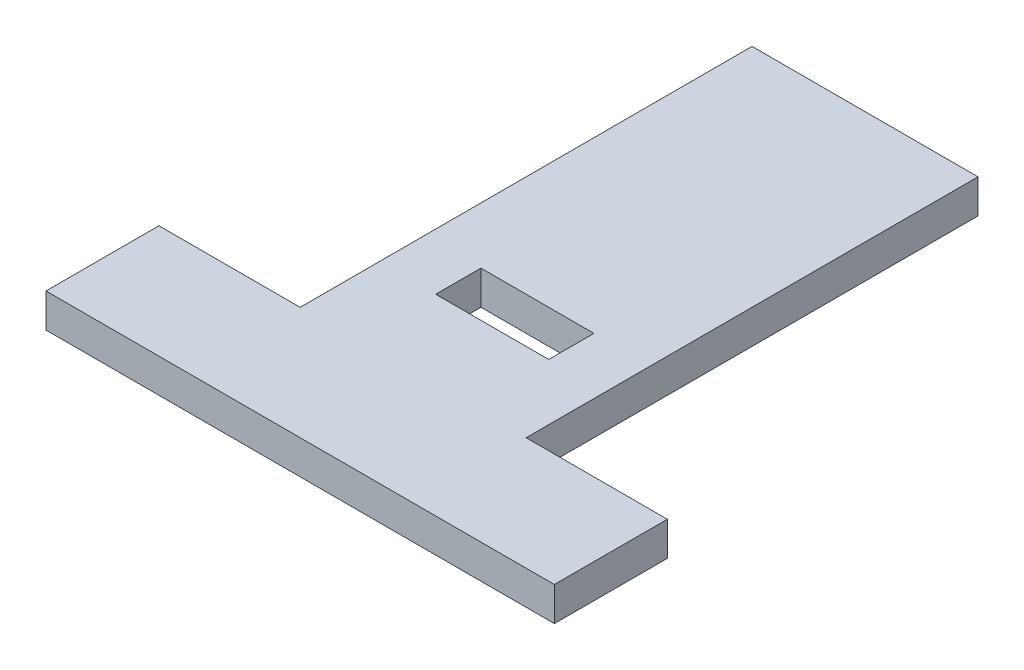
ISO-10303-21;
HEADER;
FILE_DESCRIPTION(('STEP AP214'),'2;1');
FILE_NAME('part.step','',(''),(''),'','','');
FILE_SCHEMA(('AUTOMOTIVE_DESIGN { 1 0 10303 214 1 1 1 1 }'));
ENDSEC;
DATA;
#1=APPLICATION_CONTEXT('core data for automotive mechanical design processes');
#2=APPLICATION_PROTOCOL_DEFINITION('international standard','automotive_design',2000,#1);
#3=PRODUCT_CONTEXT('',#1,'mechanical');
#4=PRODUCT('Part','Part','',(#3));
#5=PRODUCT_RELATED_PRODUCT_CATEGORY('part','',(#4));
#6=PRODUCT_DEFINITION_FORMATION('','',#4);
#7=PRODUCT_DEFINITION_CONTEXT('part definition',#1,'design');
#8=PRODUCT_DEFINITION('design','',#6,#7);
#9=PRODUCT_DEFINITION_SHAPE('','',#8);
#10=(LENGTH_UNIT() NAMED_UNIT(*) SI_UNIT(.MILLI.,.METRE.));
#11=(NAMED_UNIT(*) PLANE_ANGLE_UNIT() SI_UNIT($,.RADIAN.));
#12=(NAMED_UNIT(*) SI_UNIT($,.STERADIAN.) SOLID_ANGLE_UNIT());
#13=UNCERTAINTY_MEASURE_WITH_UNIT(LENGTH_MEASURE(1.E-05),#10,'distance_accuracy_value','');
#14=(GEOMETRIC_REPRESENTATION_CONTEXT(3) GLOBAL_UNCERTAINTY_ASSIGNED_CONTEXT((#13)) GLOBAL_UNIT_ASSIGNED_CONTEXT((#10,
#11,#12)) REPRESENTATION_CONTEXT('',''));
#15=CARTESIAN_POINT('',(0.,0.,0.));
#16=DIRECTION('',(0.,0.,1.));
#17=DIRECTION('',(1.,0.,0.));
#18=AXIS2_PLACEMENT_3D('',#15,#16,#17);
#19=CARTESIAN_POINT('',(22.5,3.,-25.));
#20=DIRECTION('',(-1.,0.,0.));
#21=DIRECTION('',(0.,0.,1.));
#22=AXIS2_PLACEMENT_3D('',#19,#20,#21);
#23=PLANE('',#22);
#24=DIRECTION('',(0.,0.,-1.));
#25=VECTOR('',#24,1.);
#26=CARTESIAN_POINT('',(22.5,0.,-25.));
#27=LINE('',#26,#25);
#28=CARTESIAN_POINT('',(22.5,0.,25.));
#29=VERTEX_POINT('',#28);
#30=CARTESIAN_POINT('',(22.5,0.,15.));
#31=VERTEX_POINT('',#30);
#32=EDGE_CURVE('E159',#29,#31,#27,.T.);
#33=ORIENTED_EDGE('',*,*,#32,.T.);
#34=DIRECTION('',(0.,1.,0.));
#35=VECTOR('',#34,1.);
#36=CARTESIAN_POINT('',(22.5,0.,15.));
#37=LINE('',#36,#35);
#38=CARTESIAN_POINT('',(22.5,3.,15.));
#39=VERTEX_POINT('',#38);
#40=EDGE_CURVE('E209',#31,#39,#37,.T.);
#41=ORIENTED_EDGE('',*,*,#40,.T.);
#42=DIRECTION('',(0.,0.,-1.));
#43=VECTOR('',#42,1.);
#44=CARTESIAN_POINT('',(22.5,3.,-25.));
#45=LINE('',#44,#43);
#46=CARTESIAN_POINT('',(22.5,3.,25.));
#47=VERTEX_POINT('',#46);
#48=EDGE_CURVE('E156',#47,#39,#45,.T.);
#49=ORIENTED_EDGE('',*,*,#48,.F.);
#50=DIRECTION('',(0.,-1.,0.));
#51=VECTOR('',#50,1.);
#52=CARTESIAN_POINT('',(22.5,3.,25.));
#53=LINE('',#52,#51);
#54=EDGE_CURVE('E47',#47,#29,#53,.T.);
#55=ORIENTED_EDGE('',*,*,#54,.T.);
#56=EDGE_LOOP('',(#33,#41,#49,#55));
#57=FACE_BOUND('',#56,.T.);
#58=ADVANCED_FACE('F39',(#57),#23,.F.);
#59=CARTESIAN_POINT('',(-22.5,3.,-25.));
#60=DIRECTION('',(0.,0.,1.));
#61=DIRECTION('',(1.,0.,0.));
#62=AXIS2_PLACEMENT_3D('',#59,#60,#61);
#63=PLANE('',#62);
#64=DIRECTION('',(-1.,0.,0.));
#65=VECTOR('',#64,1.);
#66=CARTESIAN_POINT('',(-22.5,0.,-25.));
#67=LINE('',#66,#65);
#68=CARTESIAN_POINT('',(9.99999999999999,0.,-25.));
#69=VERTEX_POINT('',#68);
#70=CARTESIAN_POINT('',(-10.,0.,-25.));
#71=VERTEX_POINT('',#70);
#72=EDGE_CURVE('E152',#69,#71,#67,.T.);
#73=ORIENTED_EDGE('',*,*,#72,.T.);
#74=DIRECTION('',(0.,1.,0.));
#75=VECTOR('',#74,1.);
#76=CARTESIAN_POINT('',(-10.,0.,-25.));
#77=LINE('',#76,#75);
#78=CARTESIAN_POINT('',(-10.,3.,-25.));
#79=VERTEX_POINT('',#78);
#80=EDGE_CURVE('E179',#71,#79,#77,.T.);
#81=ORIENTED_EDGE('',*,*,#80,.T.);
#82=DIRECTION('',(-1.,0.,0.));
#83=VECTOR('',#82,1.);
#84=CARTESIAN_POINT('',(-22.5,3.,-25.));
#85=LINE('',#84,#83);
#86=CARTESIAN_POINT('',(9.99999999999999,3.,-25.));
#87=VERTEX_POINT('',#86);
#88=EDGE_CURVE('E175',#87,#79,#85,.T.);
#89=ORIENTED_EDGE('',*,*,#88,.F.);
#90=DIRECTION('',(0.,1.,0.));
#91=VECTOR('',#90,1.);
#92=CARTESIAN_POINT('',(9.99999999999999,0.,-25.));
#93=LINE('',#92,#91);
#94=EDGE_CURVE('E201',#69,#87,#93,.T.);
#95=ORIENTED_EDGE('',*,*,#94,.F.);
#96=EDGE_LOOP('',(#73,#81,#89,#95));
#97=FACE_BOUND('',#96,.T.);
#98=ADVANCED_FACE('F267',(#97),#63,.F.);
#99=CARTESIAN_POINT('',(-22.5,3.,-25.));
#100=DIRECTION('',(1.,0.,0.));
#101=DIRECTION('',(0.,0.,-1.));
#102=AXIS2_PLACEMENT_3D('',#99,#100,#101);
#103=PLANE('',#102);
#104=DIRECTION('',(0.,0.,1.));
#105=VECTOR('',#104,1.);
#106=CARTESIAN_POINT('',(-22.5,3.,-25.));
#107=LINE('',#106,#105);
#108=CARTESIAN_POINT('',(-22.5,3.,15.0036554994902));
#109=VERTEX_POINT('',#108);
#110=CARTESIAN_POINT('',(-22.5,3.,25.));
#111=VERTEX_POINT('',#110);
#112=EDGE_CURVE('E144',#109,#111,#107,.T.);
#113=ORIENTED_EDGE('',*,*,#112,.F.);
#114=DIRECTION('',(0.,1.,0.));
#115=VECTOR('',#114,1.);
#116=CARTESIAN_POINT('',(-22.5,0.,15.0036554994902));
#117=LINE('',#116,#115);
#118=CARTESIAN_POINT('',(-22.5,0.,15.0036554994902));
#119=VERTEX_POINT('',#118);
#120=EDGE_CURVE('E131',#119,#109,#117,.T.);
#121=ORIENTED_EDGE('',*,*,#120,.F.);
#122=DIRECTION('',(0.,0.,1.));
#123=VECTOR('',#122,1.);
#124=CARTESIAN_POINT('',(-22.5,0.,-25.));
#125=LINE('',#124,#123);
#126=CARTESIAN_POINT('',(-22.5,0.,25.));
#127=VERTEX_POINT('',#126);
#128=EDGE_CURVE('E143',#119,#127,#125,.T.);
#129=ORIENTED_EDGE('',*,*,#128,.T.);
#130=DIRECTION('',(0.,-1.,0.));
#131=VECTOR('',#130,1.);
#132=CARTESIAN_POINT('',(-22.5,3.,25.));
#133=LINE('',#132,#131);
#134=EDGE_CURVE('E11',#111,#127,#133,.T.);
#135=ORIENTED_EDGE('',*,*,#134,.F.);
#136=EDGE_LOOP('',(#113,#121,#129,#135));
#137=FACE_BOUND('',#136,.T.);
#138=ADVANCED_FACE('F141',(#137),#103,.F.);
#139=CARTESIAN_POINT('',(-22.5,3.,25.));
#140=DIRECTION('',(0.,0.,-1.));
#141=DIRECTION('',(-1.,0.,0.));
#142=AXIS2_PLACEMENT_3D('',#139,#140,#141);
#143=PLANE('',#142);
#144=DIRECTION('',(1.,0.,0.));
#145=VECTOR('',#144,1.);
#146=CARTESIAN_POINT('',(-22.5,0.,25.));
#147=LINE('',#146,#145);
#148=EDGE_CURVE('E150',#127,#29,#147,.T.);
#149=ORIENTED_EDGE('',*,*,#148,.T.);
#150=ORIENTED_EDGE('',*,*,#54,.F.);
#151=DIRECTION('',(1.,0.,0.));
#152=VECTOR('',#151,1.);
#153=CARTESIAN_POINT('',(-22.5,3.,25.));
#154=LINE('',#153,#152);
#155=EDGE_CURVE('E164',#111,#47,#154,.T.);
#156=ORIENTED_EDGE('',*,*,#155,.F.);
#157=ORIENTED_EDGE('',*,*,#134,.T.);
#158=EDGE_LOOP('',(#149,#150,#156,#157));
#159=FACE_BOUND('',#158,.T.);
#160=ADVANCED_FACE('F292',(#159),#143,.F.);
#161=CARTESIAN_POINT('',(0.,3.,0.));
#162=DIRECTION('',(0.,1.,0.));
#163=DIRECTION('',(0.,0.,1.));
#164=AXIS2_PLACEMENT_3D('',#161,#162,#163);
#165=PLANE('',#164);
#166=DIRECTION('',(0.,0.,-1.));
#167=VECTOR('',#166,1.);
#168=CARTESIAN_POINT('',(-10.,3.,-25.));
#169=LINE('',#168,#167);
#170=CARTESIAN_POINT('',(-10.,3.,15.0036554994902));
#171=VERTEX_POINT('',#170);
#172=EDGE_CURVE('E137',#171,#79,#169,.T.);
#173=ORIENTED_EDGE('',*,*,#172,.F.);
#174=DIRECTION('',(1.,0.,0.));
#175=VECTOR('',#174,1.);
#176=CARTESIAN_POINT('',(-22.5,3.,15.0036554994902));
#177=LINE('',#176,#175);
#178=EDGE_CURVE('E212',#109,#171,#177,.T.);
#179=ORIENTED_EDGE('',*,*,#178,.F.);
#180=ORIENTED_EDGE('',*,*,#112,.T.);
#181=ORIENTED_EDGE('',*,*,#155,.T.);
#182=ORIENTED_EDGE('',*,*,#48,.T.);
#183=DIRECTION('',(1.,0.,0.));
#184=VECTOR('',#183,1.);
#185=CARTESIAN_POINT('',(22.5,3.,15.));
#186=LINE('',#185,#184);
#187=CARTESIAN_POINT('',(10.,3.,15.));
#188=VERTEX_POINT('',#187);
#189=EDGE_CURVE('E197',#188,#39,#186,.T.);
#190=ORIENTED_EDGE('',*,*,#189,.F.);
#191=DIRECTION('',(0.,0.,1.));
#192=VECTOR('',#191,1.);
#193=CARTESIAN_POINT('',(9.99999999999999,3.,-25.));
#194=LINE('',#193,#192);
#195=EDGE_CURVE('E202',#87,#188,#194,.T.);
#196=ORIENTED_EDGE('',*,*,#195,.F.);
#197=ORIENTED_EDGE('',*,*,#88,.T.);
#198=EDGE_LOOP('',(#173,#179,#180,#181,#182,#190,#196,#197));
#199=FACE_BOUND('',#198,.T.);
#200=DIRECTION('',(0.,0.,1.));
#201=VECTOR('',#200,1.);
#202=CARTESIAN_POINT('',(-5.,3.,4.));
#203=LINE('',#202,#201);
#204=CARTESIAN_POINT('',(-5.,3.,4.));
#205=VERTEX_POINT('',#204);
#206=CARTESIAN_POINT('',(-5.,3.,8.));
#207=VERTEX_POINT('',#206);
#208=EDGE_CURVE('E54',#205,#207,#203,.T.);
#209=ORIENTED_EDGE('',*,*,#208,.F.);
#210=DIRECTION('',(-1.,0.,0.));
#211=VECTOR('',#210,1.);
#212=CARTESIAN_POINT('',(-5.,3.,4.));
#213=LINE('',#212,#211);
#214=CARTESIAN_POINT('',(5.,3.,4.));
#215=VERTEX_POINT('',#214);
#216=EDGE_CURVE('E223',#215,#205,#213,.T.);
#217=ORIENTED_EDGE('',*,*,#216,.F.);
#218=DIRECTION('',(0.,0.,-1.));
#219=VECTOR('',#218,1.);
#220=CARTESIAN_POINT('',(5.,3.,4.));
#221=LINE('',#220,#219);
#222=CARTESIAN_POINT('',(5.,3.,8.));
#223=VERTEX_POINT('',#222);
#224=EDGE_CURVE('E242',#223,#215,#221,.T.);
#225=ORIENTED_EDGE('',*,*,#224,.F.);
#226=DIRECTION('',(1.,0.,0.));
#227=VECTOR('',#226,1.);
#228=CARTESIAN_POINT('',(-5.,3.,8.));
#229=LINE('',#228,#227);
#230=EDGE_CURVE('E238',#207,#223,#229,.T.);
#231=ORIENTED_EDGE('',*,*,#230,.F.);
#232=EDGE_LOOP('',(#209,#217,#225,#231));
#233=FACE_BOUND('',#232,.T.);
#234=ADVANCED_FACE('F263',(#199,#233),#165,.T.);
#235=CARTESIAN_POINT('',(0.,0.,0.));
#236=DIRECTION('',(0.,1.,0.));
#237=DIRECTION('',(0.,0.,1.));
#238=AXIS2_PLACEMENT_3D('',#235,#236,#237);
#239=PLANE('',#238);
#240=DIRECTION('',(-1.,0.,0.));
#241=VECTOR('',#240,1.);
#242=CARTESIAN_POINT('',(-5.,0.,4.));
#243=LINE('',#242,#241);
#244=CARTESIAN_POINT('',(5.,0.,4.));
#245=VERTEX_POINT('',#244);
#246=CARTESIAN_POINT('',(-5.,0.,4.));
#247=VERTEX_POINT('',#246);
#248=EDGE_CURVE('E231',#245,#247,#243,.T.);
#249=ORIENTED_EDGE('',*,*,#248,.T.);
#250=DIRECTION('',(0.,0.,1.));
#251=VECTOR('',#250,1.);
#252=CARTESIAN_POINT('',(-5.,0.,4.));
#253=LINE('',#252,#251);
#254=CARTESIAN_POINT('',(-5.,0.,8.));
#255=VERTEX_POINT('',#254);
#256=EDGE_CURVE('E218',#247,#255,#253,.T.);
#257=ORIENTED_EDGE('',*,*,#256,.T.);
#258=DIRECTION('',(1.,0.,0.));
#259=VECTOR('',#258,1.);
#260=CARTESIAN_POINT('',(-5.,0.,8.));
#261=LINE('',#260,#259);
#262=CARTESIAN_POINT('',(5.,0.,8.));
#263=VERTEX_POINT('',#262);
#264=EDGE_CURVE('E222',#255,#263,#261,.T.);
#265=ORIENTED_EDGE('',*,*,#264,.T.);
#266=DIRECTION('',(0.,0.,-1.));
#267=VECTOR('',#266,1.);
#268=CARTESIAN_POINT('',(5.,0.,4.));
#269=LINE('',#268,#267);
#270=EDGE_CURVE('E227',#263,#245,#269,.T.);
#271=ORIENTED_EDGE('',*,*,#270,.T.);
#272=EDGE_LOOP('',(#249,#257,#265,#271));
#273=FACE_BOUND('',#272,.T.);
#274=DIRECTION('',(1.,0.,0.));
#275=VECTOR('',#274,1.);
#276=CARTESIAN_POINT('',(-22.5,0.,15.0036554994902));
#277=LINE('',#276,#275);
#278=CARTESIAN_POINT('',(-10.,0.,15.0036554994902));
#279=VERTEX_POINT('',#278);
#280=EDGE_CURVE('E127',#119,#279,#277,.T.);
#281=ORIENTED_EDGE('',*,*,#280,.T.);
#282=DIRECTION('',(0.,0.,-1.));
#283=VECTOR('',#282,1.);
#284=CARTESIAN_POINT('',(-10.,0.,-25.));
#285=LINE('',#284,#283);
#286=EDGE_CURVE('E62',#279,#71,#285,.T.);
#287=ORIENTED_EDGE('',*,*,#286,.T.);
#288=ORIENTED_EDGE('',*,*,#72,.F.);
#289=DIRECTION('',(0.,0.,1.));
#290=VECTOR('',#289,1.);
#291=CARTESIAN_POINT('',(9.99999999999999,0.,-25.));
#292=LINE('',#291,#290);
#293=CARTESIAN_POINT('',(10.,0.,15.));
#294=VERTEX_POINT('',#293);
#295=EDGE_CURVE('E192',#69,#294,#292,.T.);
#296=ORIENTED_EDGE('',*,*,#295,.T.);
#297=DIRECTION('',(1.,0.,0.));
#298=VECTOR('',#297,1.);
#299=CARTESIAN_POINT('',(22.5,0.,15.));
#300=LINE('',#299,#298);
#301=EDGE_CURVE('E196',#294,#31,#300,.T.);
#302=ORIENTED_EDGE('',*,*,#301,.T.);
#303=ORIENTED_EDGE('',*,*,#32,.F.);
#304=ORIENTED_EDGE('',*,*,#148,.F.);
#305=ORIENTED_EDGE('',*,*,#128,.F.);
#306=EDGE_LOOP('',(#281,#287,#288,#296,#302,#303,#304,#305));
#307=FACE_BOUND('',#306,.T.);
#308=ADVANCED_FACE('F148',(#273,#307),#239,.F.);
#309=CARTESIAN_POINT('',(-5.,0.,4.));
#310=DIRECTION('',(-1.,0.,0.));
#311=DIRECTION('',(0.,0.,1.));
#312=AXIS2_PLACEMENT_3D('',#309,#310,#311);
#313=PLANE('',#312);
#314=ORIENTED_EDGE('',*,*,#208,.T.);
#315=DIRECTION('',(0.,1.,0.));
#316=VECTOR('',#315,1.);
#317=CARTESIAN_POINT('',(-5.,0.,8.));
#318=LINE('',#317,#316);
#319=EDGE_CURVE('E235',#255,#207,#318,.T.);
#320=ORIENTED_EDGE('',*,*,#319,.F.);
#321=ORIENTED_EDGE('',*,*,#256,.F.);
#322=DIRECTION('',(0.,1.,0.));
#323=VECTOR('',#322,1.);
#324=CARTESIAN_POINT('',(-5.,0.,4.));
#325=LINE('',#324,#323);
#326=EDGE_CURVE('E206',#247,#205,#325,.T.);
#327=ORIENTED_EDGE('',*,*,#326,.T.);
#328=EDGE_LOOP('',(#314,#320,#321,#327));
#329=FACE_BOUND('',#328,.T.);
#330=ADVANCED_FACE('F300',(#329),#313,.F.);
#331=CARTESIAN_POINT('',(-5.,0.,4.));
#332=DIRECTION('',(0.,0.,-1.));
#333=DIRECTION('',(-1.,0.,0.));
#334=AXIS2_PLACEMENT_3D('',#331,#332,#333);
#335=PLANE('',#334);
#336=ORIENTED_EDGE('',*,*,#216,.T.);
#337=ORIENTED_EDGE('',*,*,#326,.F.);
#338=ORIENTED_EDGE('',*,*,#248,.F.);
#339=DIRECTION('',(0.,1.,0.));
#340=VECTOR('',#339,1.);
#341=CARTESIAN_POINT('',(5.,0.,4.));
#342=LINE('',#341,#340);
#343=EDGE_CURVE('E251',#245,#215,#342,.T.);
#344=ORIENTED_EDGE('',*,*,#343,.T.);
#345=EDGE_LOOP('',(#336,#337,#338,#344));
#346=FACE_BOUND('',#345,.T.);
#347=ADVANCED_FACE('F306',(#346),#335,.F.);
#348=CARTESIAN_POINT('',(5.,0.,4.));
#349=DIRECTION('',(1.,0.,0.));
#350=DIRECTION('',(0.,0.,-1.));
#351=AXIS2_PLACEMENT_3D('',#348,#349,#350);
#352=PLANE('',#351);
#353=ORIENTED_EDGE('',*,*,#224,.T.);
#354=ORIENTED_EDGE('',*,*,#343,.F.);
#355=ORIENTED_EDGE('',*,*,#270,.F.);
#356=DIRECTION('',(0.,1.,0.));
#357=VECTOR('',#356,1.);
#358=CARTESIAN_POINT('',(5.,0.,8.));
#359=LINE('',#358,#357);
#360=EDGE_CURVE('E254',#263,#223,#359,.T.);
#361=ORIENTED_EDGE('',*,*,#360,.T.);
#362=EDGE_LOOP('',(#353,#354,#355,#361));
#363=FACE_BOUND('',#362,.T.);
#364=ADVANCED_FACE('F310',(#363),#352,.F.);
#365=CARTESIAN_POINT('',(-5.,0.,8.));
#366=DIRECTION('',(0.,0.,1.));
#367=DIRECTION('',(1.,0.,0.));
#368=AXIS2_PLACEMENT_3D('',#365,#366,#367);
#369=PLANE('',#368);
#370=ORIENTED_EDGE('',*,*,#230,.T.);
#371=ORIENTED_EDGE('',*,*,#360,.F.);
#372=ORIENTED_EDGE('',*,*,#264,.F.);
#373=ORIENTED_EDGE('',*,*,#319,.T.);
#374=EDGE_LOOP('',(#370,#371,#372,#373));
#375=FACE_BOUND('',#374,.T.);
#376=ADVANCED_FACE('F307',(#375),#369,.F.);
#377=CARTESIAN_POINT('',(22.5,0.,15.));
#378=DIRECTION('',(0.,0.,1.));
#379=DIRECTION('',(1.,0.,0.));
#380=AXIS2_PLACEMENT_3D('',#377,#378,#379);
#381=PLANE('',#380);
#382=ORIENTED_EDGE('',*,*,#189,.T.);
#383=ORIENTED_EDGE('',*,*,#40,.F.);
#384=ORIENTED_EDGE('',*,*,#301,.F.);
#385=DIRECTION('',(0.,1.,0.));
#386=VECTOR('',#385,1.);
#387=CARTESIAN_POINT('',(10.,0.,15.));
#388=LINE('',#387,#386);
#389=EDGE_CURVE('E213',#294,#188,#388,.T.);
#390=ORIENTED_EDGE('',*,*,#389,.T.);
#391=EDGE_LOOP('',(#382,#383,#384,#390));
#392=FACE_BOUND('',#391,.T.);
#393=ADVANCED_FACE('F283',(#392),#381,.F.);
#394=CARTESIAN_POINT('',(9.99999999999999,0.,-25.));
#395=DIRECTION('',(-1.,0.,0.));
#396=DIRECTION('',(0.,0.,1.));
#397=AXIS2_PLACEMENT_3D('',#394,#395,#396);
#398=PLANE('',#397);
#399=ORIENTED_EDGE('',*,*,#195,.T.);
#400=ORIENTED_EDGE('',*,*,#389,.F.);
#401=ORIENTED_EDGE('',*,*,#295,.F.);
#402=ORIENTED_EDGE('',*,*,#94,.T.);
#403=EDGE_LOOP('',(#399,#400,#401,#402));
#404=FACE_BOUND('',#403,.T.);
#405=ADVANCED_FACE('F276',(#404),#398,.F.);
#406=CARTESIAN_POINT('',(-10.,0.,-25.));
#407=DIRECTION('',(1.,0.,0.));
#408=DIRECTION('',(0.,0.,-1.));
#409=AXIS2_PLACEMENT_3D('',#406,#407,#408);
#410=PLANE('',#409);
#411=ORIENTED_EDGE('',*,*,#172,.T.);
#412=ORIENTED_EDGE('',*,*,#80,.F.);
#413=ORIENTED_EDGE('',*,*,#286,.F.);
#414=DIRECTION('',(0.,1.,0.));
#415=VECTOR('',#414,1.);
#416=CARTESIAN_POINT('',(-10.,0.,15.0036554994902));
#417=LINE('',#416,#415);
#418=EDGE_CURVE('E133',#279,#171,#417,.T.);
#419=ORIENTED_EDGE('',*,*,#418,.T.);
#420=EDGE_LOOP('',(#411,#412,#413,#419));
#421=FACE_BOUND('',#420,.T.);
#422=ADVANCED_FACE('F274',(#421),#410,.F.);
#423=CARTESIAN_POINT('',(-22.5,0.,15.0036554994902));
#424=DIRECTION('',(0.,0.,1.));
#425=DIRECTION('',(1.,0.,0.));
#426=AXIS2_PLACEMENT_3D('',#423,#424,#425);
#427=PLANE('',#426);
#428=ORIENTED_EDGE('',*,*,#178,.T.);
#429=ORIENTED_EDGE('',*,*,#418,.F.);
#430=ORIENTED_EDGE('',*,*,#280,.F.);
#431=ORIENTED_EDGE('',*,*,#120,.T.);
#432=EDGE_LOOP('',(#428,#429,#430,#431));
#433=FACE_BOUND('',#432,.T.);
#434=ADVANCED_FACE('F130',(#433),#427,.F.);
#435=CLOSED_SHELL('',(#58,#98,#138,#160,#234,#308,#330,#347,#364,#376,#393,#405,#422,#434));
#436=MANIFOLD_SOLID_BREP('B2',#435);
#437=ADVANCED_BREP_SHAPE_REPRESENTATION('',(#18,#436),#14);
#438=SHAPE_DEFINITION_REPRESENTATION(#9,#437);
ENDSEC;
END-ISO-10303-21;
